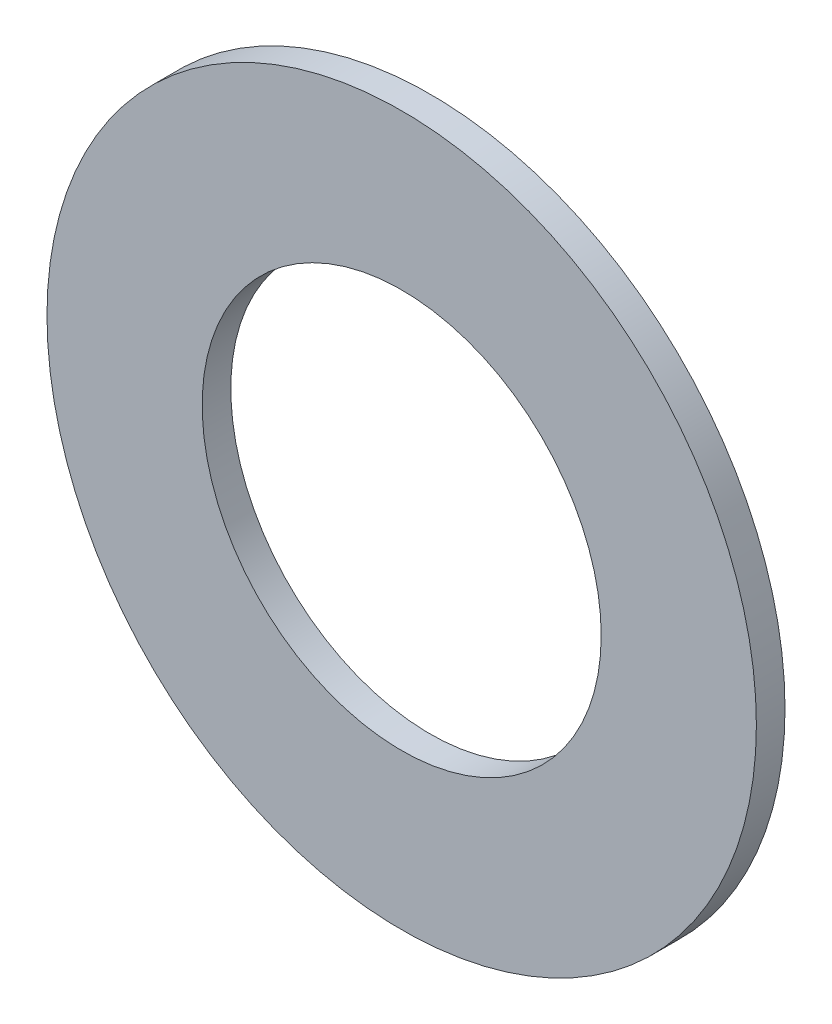
ISO-10303-21;
HEADER;
FILE_DESCRIPTION(('STEP AP214'),'2;1');
FILE_NAME('part.step','',(''),(''),'','','');
FILE_SCHEMA(('AUTOMOTIVE_DESIGN { 1 0 10303 214 1 1 1 1 }'));
ENDSEC;
DATA;
#1=APPLICATION_CONTEXT('core data for automotive mechanical design processes');
#2=APPLICATION_PROTOCOL_DEFINITION('international standard','automotive_design',2000,#1);
#3=PRODUCT_CONTEXT('',#1,'mechanical');
#4=PRODUCT('Part','Part','',(#3));
#5=PRODUCT_RELATED_PRODUCT_CATEGORY('part','',(#4));
#6=PRODUCT_DEFINITION_FORMATION('','',#4);
#7=PRODUCT_DEFINITION_CONTEXT('part definition',#1,'design');
#8=PRODUCT_DEFINITION('design','',#6,#7);
#9=PRODUCT_DEFINITION_SHAPE('','',#8);
#10=(LENGTH_UNIT() NAMED_UNIT(*) SI_UNIT(.MILLI.,.METRE.));
#11=(NAMED_UNIT(*) PLANE_ANGLE_UNIT() SI_UNIT($,.RADIAN.));
#12=(NAMED_UNIT(*) SI_UNIT($,.STERADIAN.) SOLID_ANGLE_UNIT());
#13=UNCERTAINTY_MEASURE_WITH_UNIT(LENGTH_MEASURE(1.E-05),#10,'distance_accuracy_value','');
#14=(GEOMETRIC_REPRESENTATION_CONTEXT(3) GLOBAL_UNCERTAINTY_ASSIGNED_CONTEXT((#13)) GLOBAL_UNIT_ASSIGNED_CONTEXT((#10,
#11,#12)) REPRESENTATION_CONTEXT('',''));
#15=CARTESIAN_POINT('',(0.,0.,0.));
#16=DIRECTION('',(0.,0.,1.));
#17=DIRECTION('',(1.,0.,0.));
#18=AXIS2_PLACEMENT_3D('',#15,#16,#17);
#19=CARTESIAN_POINT('',(0.,0.,1.025));
#20=DIRECTION('',(0.,0.,1.));
#21=DIRECTION('',(1.,0.,0.));
#22=AXIS2_PLACEMENT_3D('',#19,#20,#21);
#23=PLANE('',#22);
#24=CARTESIAN_POINT('',(0.,0.,1.025));
#25=DIRECTION('',(0.,0.,1.));
#26=DIRECTION('',(1.,0.,0.));
#27=AXIS2_PLACEMENT_3D('',#24,#25,#26);
#28=CIRCLE('',#27,25.4);
#29=CARTESIAN_POINT('',(25.4,0.,1.025));
#30=VERTEX_POINT('',#29);
#31=EDGE_CURVE('E10',#30,#30,#28,.T.);
#32=ORIENTED_EDGE('',*,*,#31,.T.);
#33=EDGE_LOOP('',(#32));
#34=FACE_BOUND('',#33,.T.);
#35=CARTESIAN_POINT('',(0.,0.,1.025));
#36=DIRECTION('',(0.,0.,1.));
#37=DIRECTION('',(1.,0.,0.));
#38=AXIS2_PLACEMENT_3D('',#35,#36,#37);
#39=CIRCLE('',#38,14.2875);
#40=CARTESIAN_POINT('',(14.2875,0.,1.025));
#41=VERTEX_POINT('',#40);
#42=EDGE_CURVE('E53',#41,#41,#39,.T.);
#43=ORIENTED_EDGE('',*,*,#42,.F.);
#44=EDGE_LOOP('',(#43));
#45=FACE_BOUND('',#44,.T.);
#46=ADVANCED_FACE('F45',(#34,#45),#23,.T.);
#47=CARTESIAN_POINT('',(0.,0.,1.025));
#48=DIRECTION('',(0.,0.,-1.));
#49=DIRECTION('',(-1.,0.,0.));
#50=AXIS2_PLACEMENT_3D('',#47,#48,#49);
#51=CYLINDRICAL_SURFACE('',#50,25.4);
#52=ORIENTED_EDGE('',*,*,#31,.F.);
#53=EDGE_LOOP('',(#52));
#54=FACE_BOUND('',#53,.T.);
#55=CARTESIAN_POINT('',(0.,0.,-1.025));
#56=DIRECTION('',(0.,0.,1.));
#57=DIRECTION('',(1.,0.,0.));
#58=AXIS2_PLACEMENT_3D('',#55,#56,#57);
#59=CIRCLE('',#58,25.4);
#60=CARTESIAN_POINT('',(25.4,0.,-1.025));
#61=VERTEX_POINT('',#60);
#62=EDGE_CURVE('E58',#61,#61,#59,.T.);
#63=ORIENTED_EDGE('',*,*,#62,.T.);
#64=EDGE_LOOP('',(#63));
#65=FACE_BOUND('',#64,.T.);
#66=ADVANCED_FACE('F47',(#54,#65),#51,.T.);
#67=CARTESIAN_POINT('',(0.,0.,1.025));
#68=DIRECTION('',(0.,0.,-1.));
#69=DIRECTION('',(-1.,0.,0.));
#70=AXIS2_PLACEMENT_3D('',#67,#68,#69);
#71=CYLINDRICAL_SURFACE('',#70,14.2875);
#72=ORIENTED_EDGE('',*,*,#42,.T.);
#73=EDGE_LOOP('',(#72));
#74=FACE_BOUND('',#73,.T.);
#75=CARTESIAN_POINT('',(0.,0.,-1.025));
#76=DIRECTION('',(0.,0.,1.));
#77=DIRECTION('',(1.,0.,0.));
#78=AXIS2_PLACEMENT_3D('',#75,#76,#77);
#79=CIRCLE('',#78,14.2875);
#80=CARTESIAN_POINT('',(14.2875,0.,-1.025));
#81=VERTEX_POINT('',#80);
#82=EDGE_CURVE('E63',#81,#81,#79,.T.);
#83=ORIENTED_EDGE('',*,*,#82,.F.);
#84=EDGE_LOOP('',(#83));
#85=FACE_BOUND('',#84,.T.);
#86=ADVANCED_FACE('F73',(#74,#85),#71,.F.);
#87=CARTESIAN_POINT('',(0.,0.,-1.025));
#88=DIRECTION('',(0.,0.,1.));
#89=DIRECTION('',(1.,0.,0.));
#90=AXIS2_PLACEMENT_3D('',#87,#88,#89);
#91=PLANE('',#90);
#92=ORIENTED_EDGE('',*,*,#82,.T.);
#93=EDGE_LOOP('',(#92));
#94=FACE_BOUND('',#93,.T.);
#95=ORIENTED_EDGE('',*,*,#62,.F.);
#96=EDGE_LOOP('',(#95));
#97=FACE_BOUND('',#96,.T.);
#98=ADVANCED_FACE('F70',(#94,#97),#91,.F.);
#99=CLOSED_SHELL('',(#46,#66,#86,#98));
#100=MANIFOLD_SOLID_BREP('B2',#99);
#101=ADVANCED_BREP_SHAPE_REPRESENTATION('',(#18,#100),#14);
#102=SHAPE_DEFINITION_REPRESENTATION(#9,#101);
ENDSEC;
END-ISO-10303-21;
